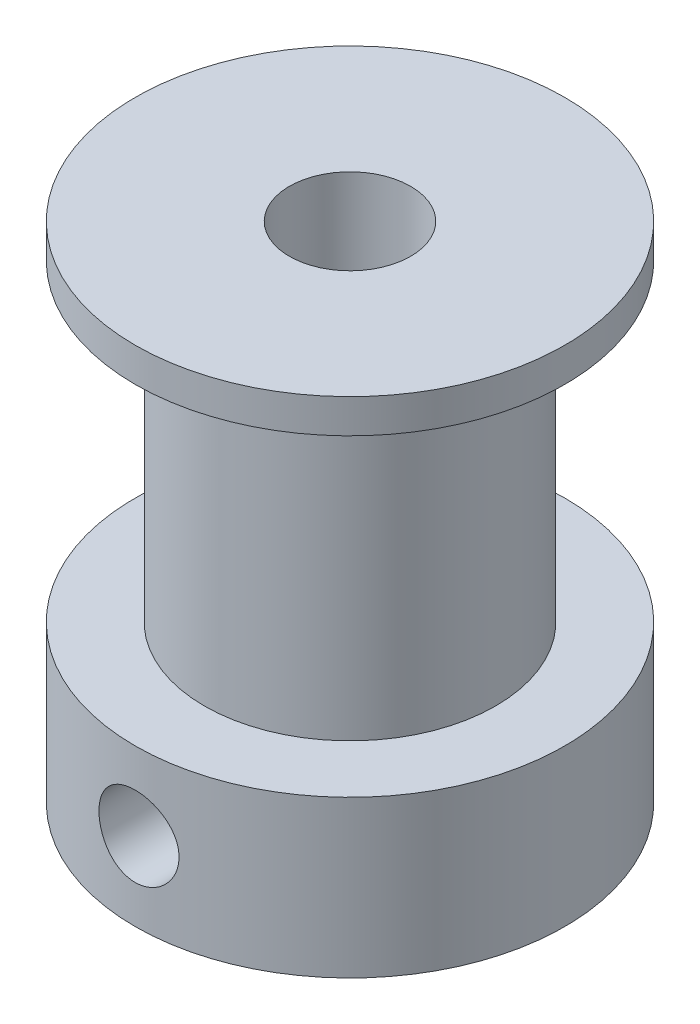
ISO-10303-21;
HEADER;
FILE_DESCRIPTION(('STEP AP214'),'2;1');
FILE_NAME('part.step','',(''),(''),'','','');
FILE_SCHEMA(('AUTOMOTIVE_DESIGN { 1 0 10303 214 1 1 1 1 }'));
ENDSEC;
DATA;
#1=APPLICATION_CONTEXT('core data for automotive mechanical design processes');
#2=APPLICATION_PROTOCOL_DEFINITION('international standard','automotive_design',2000,#1);
#3=PRODUCT_CONTEXT('',#1,'mechanical');
#4=PRODUCT('Part','Part','',(#3));
#5=PRODUCT_RELATED_PRODUCT_CATEGORY('part','',(#4));
#6=PRODUCT_DEFINITION_FORMATION('','',#4);
#7=PRODUCT_DEFINITION_CONTEXT('part definition',#1,'design');
#8=PRODUCT_DEFINITION('design','',#6,#7);
#9=PRODUCT_DEFINITION_SHAPE('','',#8);
#10=(LENGTH_UNIT() NAMED_UNIT(*) SI_UNIT(.MILLI.,.METRE.));
#11=(NAMED_UNIT(*) PLANE_ANGLE_UNIT() SI_UNIT($,.RADIAN.));
#12=(NAMED_UNIT(*) SI_UNIT($,.STERADIAN.) SOLID_ANGLE_UNIT());
#13=UNCERTAINTY_MEASURE_WITH_UNIT(LENGTH_MEASURE(1.E-05),#10,'distance_accuracy_value','');
#14=(GEOMETRIC_REPRESENTATION_CONTEXT(3) GLOBAL_UNCERTAINTY_ASSIGNED_CONTEXT((#13)) GLOBAL_UNIT_ASSIGNED_CONTEXT((#10,
#11,#12)) REPRESENTATION_CONTEXT('',''));
#15=CARTESIAN_POINT('',(0.,0.,0.));
#16=DIRECTION('',(0.,0.,1.));
#17=DIRECTION('',(1.,0.,0.));
#18=AXIS2_PLACEMENT_3D('',#15,#16,#17);
#19=CARTESIAN_POINT('',(0.,0.,0.));
#20=DIRECTION('',(0.,-1.,0.));
#21=DIRECTION('',(0.,0.,-1.));
#22=AXIS2_PLACEMENT_3D('',#19,#20,#21);
#23=CYLINDRICAL_SURFACE('',#22,2.5);
#24=CARTESIAN_POINT('',(-1.8781639970993,3.225,-1.65));
#25=CARTESIAN_POINT('',(-1.87817356740867,3.30579427655975,-1.64999443072167));
#26=CARTESIAN_POINT('',(-1.88347418282792,3.38662636905579,-1.64401449371116));
#27=CARTESIAN_POINT('',(-1.90365752241832,3.54541795060532,-1.62058860250623));
#28=CARTESIAN_POINT('',(-1.9185574504896,3.62337201591593,-1.60312206083479));
#29=CARTESIAN_POINT('',(-1.95530612756548,3.77363333158224,-1.55807727538571));
#30=CARTESIAN_POINT('',(-1.97708883218856,3.84598643150526,-1.53059477126484));
#31=CARTESIAN_POINT('',(-2.02503214275444,3.98494524738078,-1.46657517741326));
#32=CARTESIAN_POINT('',(-2.05119370638084,4.05154970122849,-1.43003610611277));
#33=CARTESIAN_POINT('',(-2.10971828562918,4.18821736687682,-1.342483593019));
#34=CARTESIAN_POINT('',(-2.14241946389367,4.25726727651007,-1.29011420470095));
#35=CARTESIAN_POINT('',(-2.20758221587981,4.38647714614391,-1.17514144468482));
#36=CARTESIAN_POINT('',(-2.24004353252863,4.44662860029669,-1.11252840012499));
#37=CARTESIAN_POINT('',(-2.3064419767716,4.56473271619889,-0.968234915676898));
#38=CARTESIAN_POINT('',(-2.33994640603816,4.62119090363769,-0.885111648041922));
#39=CARTESIAN_POINT('',(-2.39949293751456,4.71884115428655,-0.707908997031479));
#40=CARTESIAN_POINT('',(-2.42554320107045,4.76004992824281,-0.613841755901944));
#41=CARTESIAN_POINT('',(-2.46464353514927,4.82107361226671,-0.428365536633289));
#42=CARTESIAN_POINT('',(-2.47881191391302,4.84274914948944,-0.337811072451694));
#43=CARTESIAN_POINT('',(-2.49700266516609,4.87049014711654,-0.153380704926468));
#44=CARTESIAN_POINT('',(-2.50103745363967,4.87657471024375,-0.0595090091735767));
#45=CARTESIAN_POINT('',(-2.49868729659539,4.87300862462096,0.113712663637895));
#46=CARTESIAN_POINT('',(-2.49376656842582,4.86556933208685,0.193140500290932));
#47=CARTESIAN_POINT('',(-2.47671798966374,4.83953692457822,0.3493383081911));
#48=CARTESIAN_POINT('',(-2.46458960851095,4.8209429885018,0.426108083336214));
#49=CARTESIAN_POINT('',(-2.4341916732427,4.77358528412734,0.574862419576147));
#50=CARTESIAN_POINT('',(-2.41593946394568,4.74485022722838,0.646859815580448));
#51=CARTESIAN_POINT('',(-2.37464804586783,4.67831789592823,0.785017034503281));
#52=CARTESIAN_POINT('',(-2.35160793342518,4.64051891060689,0.851175752075152));
#53=CARTESIAN_POINT('',(-2.29902245001357,4.55144819163509,0.985047000791304));
#54=CARTESIAN_POINT('',(-2.26902056419845,4.49906230137878,1.05183695764555));
#55=CARTESIAN_POINT('',(-2.2070921891754,4.38519022775839,1.17625968695307));
#56=CARTESIAN_POINT('',(-2.17516278943165,4.32369006733423,1.2338781079658));
#57=CARTESIAN_POINT('',(-2.10711048312635,4.18250690257425,1.34724934289721));
#58=CARTESIAN_POINT('',(-2.07108428413496,4.10148069757491,1.40139996434746));
#59=CARTESIAN_POINT('',(-2.0043795765937,3.92947022283534,1.49525229324492));
#60=CARTESIAN_POINT('',(-1.973691925336,3.8385034211415,1.53497883258691));
#61=CARTESIAN_POINT('',(-1.93021206234819,3.67504901179961,1.58906609884216));
#62=CARTESIAN_POINT('',(-1.91481376393407,3.60458306194073,1.60742065844977));
#63=CARTESIAN_POINT('',(-1.89156962487726,3.46068483824098,1.63471528383588));
#64=CARTESIAN_POINT('',(-1.88371114115,3.38725774603094,1.64367111218457));
#65=CARTESIAN_POINT('',(-1.8767563549997,3.23913898103529,1.65161100823904));
#66=CARTESIAN_POINT('',(-1.87769482426888,3.16444345582033,1.65055550398266));
#67=CARTESIAN_POINT('',(-1.88825914723377,3.01646670785288,1.6384550878589));
#68=CARTESIAN_POINT('',(-1.89789215655036,2.94318670082213,1.62740194790476));
#69=CARTESIAN_POINT('',(-1.92377320788271,2.80315606994752,1.59670654181037));
#70=CARTESIAN_POINT('',(-1.9397182942886,2.7362601566981,1.57745493961547));
#71=CARTESIAN_POINT('',(-1.97637475195715,2.60658821030647,1.53127715983157));
#72=CARTESIAN_POINT('',(-1.99708770330354,2.54381355184297,1.50434843731629));
#73=CARTESIAN_POINT('',(-2.04592024038531,2.41084653371123,1.43744371796295));
#74=CARTESIAN_POINT('',(-2.0746933834994,2.34166627761783,1.3959374151933));
#75=CARTESIAN_POINT('',(-2.13386307226145,2.2104540035836,1.30370192953132));
#76=CARTESIAN_POINT('',(-2.16426156090022,2.14843083426984,1.2529615255776));
#77=CARTESIAN_POINT('',(-2.23066104299162,2.02002279309447,1.13132559349666));
#78=CARTESIAN_POINT('',(-2.26650752858329,1.95542825569478,1.0584336843705));
#79=CARTESIAN_POINT('',(-2.33354741548986,1.83929294484175,0.901029136145232));
#80=CARTESIAN_POINT('',(-2.36474520160667,1.78773983785047,0.816527594120797));
#81=CARTESIAN_POINT('',(-2.41383928477658,1.70846296196824,0.655022436944607));
#82=CARTESIAN_POINT('',(-2.43314294605933,1.67805320616478,0.579766982761487));
#83=CARTESIAN_POINT('',(-2.46500344203446,1.62840770004291,0.424305717798088));
#84=CARTESIAN_POINT('',(-2.47756592552064,1.60916259316718,0.344104114697706));
#85=CARTESIAN_POINT('',(-2.49483359194805,1.58280779187866,0.180532057501464));
#86=CARTESIAN_POINT('',(-2.49950622522129,1.57574836698325,0.0971499203467964));
#87=CARTESIAN_POINT('',(-2.50041880991432,1.57436521725825,-0.0697703046886496));
#88=CARTESIAN_POINT('',(-2.49665914509096,1.58004091284884,-0.153308385299506));
#89=CARTESIAN_POINT('',(-2.48162224491363,1.60295948175331,-0.31224884206867));
#90=CARTESIAN_POINT('',(-2.47086791156197,1.61939826797345,-0.387820405838241));
#91=CARTESIAN_POINT('',(-2.44325497490618,1.66222616352496,-0.534890956581204));
#92=CARTESIAN_POINT('',(-2.4263954123254,1.68861683656131,-0.606389301510793));
#93=CARTESIAN_POINT('',(-2.38659098522815,1.75225696718865,-0.748299731070002));
#94=CARTESIAN_POINT('',(-2.36333062488106,1.79008395318078,-0.818362050887261));
#95=CARTESIAN_POINT('',(-2.31298664760703,1.87460758414193,-0.951399734920284));
#96=CARTESIAN_POINT('',(-2.2859005630314,1.92130996063965,-1.0143704774724));
#97=CARTESIAN_POINT('',(-2.22528132748969,2.03052907515258,-1.14186276834818));
#98=CARTESIAN_POINT('',(-2.19140310364951,2.09437720174746,-1.20508031729177));
#99=CARTESIAN_POINT('',(-2.12387294022856,2.23156834044152,-1.32046767601713));
#100=CARTESIAN_POINT('',(-2.09022116132146,2.30491747200145,-1.37263030790415));
#101=CARTESIAN_POINT('',(-2.02963185186414,2.45297320198263,-1.46053735742483));
#102=CARTESIAN_POINT('',(-2.00236030827309,2.52689495776457,-1.49736813204505));
#103=CARTESIAN_POINT('',(-1.95397052678841,2.68110913288329,-1.55999123252305));
#104=CARTESIAN_POINT('',(-1.93283919103843,2.76138751989308,-1.58580711054237));
#105=CARTESIAN_POINT('',(-1.90415675714691,2.9056913968137,-1.62004735146957));
#106=CARTESIAN_POINT('',(-1.89451740482451,2.96864690760695,-1.63122690692698));
#107=CARTESIAN_POINT('',(-1.88151889606352,3.09606080182247,-1.64620346660995));
#108=CARTESIAN_POINT('',(-1.8781563590673,3.16051835732424,-1.65000444482246));
#109=CARTESIAN_POINT('',(-1.8781639970993,3.225,-1.65));
#110=B_SPLINE_CURVE_WITH_KNOTS('',3,(#24,#25,#26,#27,#28,#29,#30,#31,#32,#33,#34,#35,#36,#37,
#38,#39,#40,#41,#42,#43,#44,#45,#46,#47,#48,#49,#50,#51,#52,#53,#54,#55,#56,#57,#58,#59,#60,#61,
#62,#63,#64,#65,#66,#67,#68,#69,#70,#71,#72,#73,#74,#75,#76,#77,#78,#79,#80,#81,#82,#83,#84,#85,
#86,#87,#88,#89,#90,#91,#92,#93,#94,#95,#96,#97,#98,#99,#100,#101,#102,#103,#104,#105,#106,#107,
#108,#109),.UNSPECIFIED.,.T.,.F.,(4,2,2,2,2,2,2,2,2,2,2,2,2,2,2,2,2,2,2,2,2,2,2,2,2,2,2,2,2,2,2,
2,2,2,2,2,2,2,2,2,2,2,4),(0.,0.242089089232209,0.484613262365225,0.724877542229117,
0.965194438206264,1.24204242334406,1.5191533550871,1.83517136959404,2.1508420497088,
2.43163690958526,2.71208756281942,2.95071293244789,3.18935586962917,3.42732851395789,
3.66534611375403,3.93440451568683,4.20387988176699,4.51414003592554,4.82386349786489,
5.04625677123859,5.26827647088753,5.49117411610791,5.71425537389902,5.92772322794784,
6.14126192794924,6.39732261532281,6.65369656488882,6.9635657507811,7.27314078239636,
7.52238413686408,7.77141830954321,8.02147738775785,8.27152508592672,8.50474641601317,
8.73800440662634,8.98590102363144,9.23395827408608,9.52089661145361,9.80802068929721,
10.067982581361,10.327385800336,10.5207004402689,10.713910935025),.UNSPECIFIED.);
#111=CARTESIAN_POINT('',(-1.8781639970993,3.225,-1.65));
#112=VERTEX_POINT('',#111);
#113=EDGE_CURVE('E121',#112,#112,#110,.T.);
#114=ORIENTED_EDGE('',*,*,#113,.F.);
#115=EDGE_LOOP('',(#114));
#116=FACE_BOUND('',#115,.T.);
#117=CARTESIAN_POINT('',(-1.64999999999999,3.225,1.8781639970993));
#118=CARTESIAN_POINT('',(-1.64999443072166,3.30579427655975,1.87817356740867));
#119=CARTESIAN_POINT('',(-1.64401449371115,3.38662636905579,1.88347418282793));
#120=CARTESIAN_POINT('',(-1.62058860250622,3.54541795060532,1.90365752241832));
#121=CARTESIAN_POINT('',(-1.60312206083479,3.62337201591593,1.91855745048961));
#122=CARTESIAN_POINT('',(-1.5580772753857,3.77363333158224,1.95530612756548));
#123=CARTESIAN_POINT('',(-1.53059477126484,3.84598643150526,1.97708883218856));
#124=CARTESIAN_POINT('',(-1.46657517741325,3.98494524738078,2.02503214275445));
#125=CARTESIAN_POINT('',(-1.43003610611276,4.05154970122849,2.05119370638085));
#126=CARTESIAN_POINT('',(-1.34248359301899,4.18821736687682,2.10971828562919));
#127=CARTESIAN_POINT('',(-1.29011420470094,4.25726727651007,2.14241946389367));
#128=CARTESIAN_POINT('',(-1.17514144468481,4.38647714614391,2.20758221587982));
#129=CARTESIAN_POINT('',(-1.11252840012498,4.44662860029669,2.24004353252863));
#130=CARTESIAN_POINT('',(-0.968234915676889,4.56473271619889,2.3064419767716));
#131=CARTESIAN_POINT('',(-0.885111648041914,4.62119090363769,2.33994640603817));
#132=CARTESIAN_POINT('',(-0.70790899703147,4.71884115428655,2.39949293751456));
#133=CARTESIAN_POINT('',(-0.613841755901935,4.76004992824282,2.42554320107045));
#134=CARTESIAN_POINT('',(-0.42836553663328,4.82107361226671,2.46464353514927));
#135=CARTESIAN_POINT('',(-0.337811072451685,4.84274914948944,2.47881191391302));
#136=CARTESIAN_POINT('',(-0.153380704926458,4.87049014711654,2.49700266516609));
#137=CARTESIAN_POINT('',(-0.0595090091735671,4.87657471024375,2.50103745363967));
#138=CARTESIAN_POINT('',(0.113712663637905,4.87300862462096,2.49868729659539));
#139=CARTESIAN_POINT('',(0.193140500290941,4.86556933208685,2.49376656842582));
#140=CARTESIAN_POINT('',(0.349338308191109,4.83953692457822,2.47671798966374));
#141=CARTESIAN_POINT('',(0.426108083336223,4.8209429885018,2.46458960851095));
#142=CARTESIAN_POINT('',(0.574862419576157,4.77358528412734,2.4341916732427));
#143=CARTESIAN_POINT('',(0.646859815580457,4.74485022722838,2.41593946394568));
#144=CARTESIAN_POINT('',(0.78501703450329,4.67831789592823,2.37464804586783));
#145=CARTESIAN_POINT('',(0.851175752075161,4.64051891060689,2.35160793342517));
#146=CARTESIAN_POINT('',(0.985047000791314,4.55144819163509,2.29902245001356));
#147=CARTESIAN_POINT('',(1.05183695764556,4.49906230137878,2.26902056419845));
#148=CARTESIAN_POINT('',(1.17625968695308,4.38519022775838,2.20709218917539));
#149=CARTESIAN_POINT('',(1.23387810796581,4.32369006733423,2.17516278943164));
#150=CARTESIAN_POINT('',(1.34724934289721,4.18250690257425,2.10711048312634));
#151=CARTESIAN_POINT('',(1.40139996434747,4.10148069757491,2.07108428413495));
#152=CARTESIAN_POINT('',(1.49525229324493,3.92947022283534,2.00437957659369));
#153=CARTESIAN_POINT('',(1.53497883258691,3.8385034211415,1.973691925336));
#154=CARTESIAN_POINT('',(1.58906609884217,3.67504901179961,1.93021206234819));
#155=CARTESIAN_POINT('',(1.60742065844978,3.60458306194073,1.91481376393406));
#156=CARTESIAN_POINT('',(1.63471528383588,3.46068483824098,1.89156962487725));
#157=CARTESIAN_POINT('',(1.64367111218458,3.38725774603093,1.88371114115));
#158=CARTESIAN_POINT('',(1.65161100823905,3.23913898103529,1.8767563549997));
#159=CARTESIAN_POINT('',(1.65055550398267,3.16444345582033,1.87769482426888));
#160=CARTESIAN_POINT('',(1.63845508785891,3.01646670785288,1.88825914723377));
#161=CARTESIAN_POINT('',(1.62740194790476,2.94318670082213,1.89789215655036));
#162=CARTESIAN_POINT('',(1.59670654181038,2.80315606994752,1.92377320788271));
#163=CARTESIAN_POINT('',(1.57745493961548,2.7362601566981,1.9397182942886));
#164=CARTESIAN_POINT('',(1.53127715983158,2.60658821030647,1.97637475195714));
#165=CARTESIAN_POINT('',(1.50434843731629,2.54381355184297,1.99708770330354));
#166=CARTESIAN_POINT('',(1.43744371796296,2.41084653371123,2.0459202403853));
#167=CARTESIAN_POINT('',(1.39593741519331,2.34166627761783,2.07469338349939));
#168=CARTESIAN_POINT('',(1.30370192953132,2.2104540035836,2.13386307226145));
#169=CARTESIAN_POINT('',(1.25296152557761,2.14843083426984,2.16426156090021));
#170=CARTESIAN_POINT('',(1.13132559349666,2.02002279309446,2.23066104299161));
#171=CARTESIAN_POINT('',(1.0584336843705,1.95542825569478,2.26650752858329));
#172=CARTESIAN_POINT('',(0.901029136145238,1.83929294484174,2.33354741548986));
#173=CARTESIAN_POINT('',(0.816527594120802,1.78773983785047,2.36474520160667));
#174=CARTESIAN_POINT('',(0.655022436944612,1.70846296196824,2.41383928477658));
#175=CARTESIAN_POINT('',(0.579766982761492,1.67805320616478,2.43314294605933));
#176=CARTESIAN_POINT('',(0.424305717798094,1.62840770004291,2.46500344203446));
#177=CARTESIAN_POINT('',(0.344104114697712,1.60916259316718,2.47756592552063));
#178=CARTESIAN_POINT('',(0.18053205750147,1.58280779187866,2.49483359194805));
#179=CARTESIAN_POINT('',(0.0971499203468021,1.57574836698325,2.49950622522129));
#180=CARTESIAN_POINT('',(-0.0697703046886438,1.57436521725825,2.50041880991432));
#181=CARTESIAN_POINT('',(-0.1533083852995,1.58004091284884,2.49665914509096));
#182=CARTESIAN_POINT('',(-0.312248842068665,1.60295948175331,2.48162224491364));
#183=CARTESIAN_POINT('',(-0.387820405838235,1.61939826797345,2.47086791156197));
#184=CARTESIAN_POINT('',(-0.534890956581198,1.66222616352496,2.44325497490618));
#185=CARTESIAN_POINT('',(-0.606389301510787,1.68861683656131,2.4263954123254));
#186=CARTESIAN_POINT('',(-0.748299731069997,1.75225696718865,2.38659098522815));
#187=CARTESIAN_POINT('',(-0.818362050887255,1.79008395318078,2.36333062488106));
#188=CARTESIAN_POINT('',(-0.951399734920279,1.87460758414193,2.31298664760704));
#189=CARTESIAN_POINT('',(-1.01437047747239,1.92130996063965,2.2859005630314));
#190=CARTESIAN_POINT('',(-1.14186276834818,2.03052907515258,2.2252813274897));
#191=CARTESIAN_POINT('',(-1.20508031729177,2.09437720174746,2.19140310364951));
#192=CARTESIAN_POINT('',(-1.32046767601712,2.23156834044153,2.12387294022856));
#193=CARTESIAN_POINT('',(-1.37263030790415,2.30491747200145,2.09022116132146));
#194=CARTESIAN_POINT('',(-1.46053735742482,2.45297320198263,2.02963185186414));
#195=CARTESIAN_POINT('',(-1.49736813204505,2.52689495776457,2.00236030827309));
#196=CARTESIAN_POINT('',(-1.55999123252305,2.68110913288329,1.95397052678842));
#197=CARTESIAN_POINT('',(-1.58580711054236,2.76138751989309,1.93283919103844));
#198=CARTESIAN_POINT('',(-1.62004735146956,2.9056913968137,1.90415675714692));
#199=CARTESIAN_POINT('',(-1.63122690692697,2.96864690760695,1.89451740482452));
#200=CARTESIAN_POINT('',(-1.64620346660994,3.09606080182247,1.88151889606352));
#201=CARTESIAN_POINT('',(-1.65000444482246,3.16051835732424,1.87815635906731));
#202=CARTESIAN_POINT('',(-1.64999999999999,3.225,1.8781639970993));
#203=B_SPLINE_CURVE_WITH_KNOTS('',3,(#117,#118,#119,#120,#121,#122,#123,#124,#125,#126,#127,
#128,#129,#130,#131,#132,#133,#134,#135,#136,#137,#138,#139,#140,#141,#142,#143,#144,#145,#146,
#147,#148,#149,#150,#151,#152,#153,#154,#155,#156,#157,#158,#159,#160,#161,#162,#163,#164,#165,
#166,#167,#168,#169,#170,#171,#172,#173,#174,#175,#176,#177,#178,#179,#180,#181,#182,#183,#184,
#185,#186,#187,#188,#189,#190,#191,#192,#193,#194,#195,#196,#197,#198,#199,#200,#201,#202),
.UNSPECIFIED.,.T.,.F.,(4,2,2,2,2,2,2,2,2,2,2,2,2,2,2,2,2,2,2,2,2,2,2,2,2,2,2,2,2,2,2,2,2,2,2,2,
2,2,2,2,2,2,4),(0.,0.242089089232209,0.484613262365225,0.724877542229118,0.965194438206264,
1.24204242334406,1.5191533550871,1.83517136959404,2.1508420497088,2.43163690958526,
2.71208756281942,2.95071293244789,3.18935586962917,3.42732851395789,3.66534611375403,
3.93440451568684,4.20387988176699,4.51414003592554,4.82386349786489,5.04625677123859,
5.26827647088753,5.49117411610792,5.71425537389902,5.92772322794784,6.14126192794924,
6.39732261532282,6.65369656488882,6.9635657507811,7.27314078239636,7.52238413686409,
7.77141830954321,8.02147738775785,8.27152508592672,8.50474641601317,8.73800440662634,
8.98590102363144,9.23395827408609,9.52089661145361,9.80802068929721,10.067982581361,
10.327385800336,10.5207004402689,10.713910935025),.UNSPECIFIED.);
#204=CARTESIAN_POINT('',(-1.64999999999999,3.225,1.8781639970993));
#205=VERTEX_POINT('',#204);
#206=EDGE_CURVE('E65',#205,#205,#203,.T.);
#207=ORIENTED_EDGE('',*,*,#206,.F.);
#208=EDGE_LOOP('',(#207));
#209=FACE_BOUND('',#208,.T.);
#210=CARTESIAN_POINT('',(0.,0.,0.));
#211=DIRECTION('',(0.,-1.,0.));
#212=DIRECTION('',(0.,0.,-1.));
#213=AXIS2_PLACEMENT_3D('',#210,#211,#212);
#214=CIRCLE('',#213,2.5);
#215=CARTESIAN_POINT('',(0.,0.,-2.5));
#216=VERTEX_POINT('',#215);
#217=EDGE_CURVE('E62',#216,#216,#214,.T.);
#218=ORIENTED_EDGE('',*,*,#217,.T.);
#219=EDGE_LOOP('',(#218));
#220=FACE_BOUND('',#219,.T.);
#221=CARTESIAN_POINT('',(0.,20.75,0.));
#222=DIRECTION('',(0.,-1.,0.));
#223=DIRECTION('',(0.,0.,-1.));
#224=AXIS2_PLACEMENT_3D('',#221,#222,#223);
#225=CIRCLE('',#224,2.5);
#226=CARTESIAN_POINT('',(0.,20.75,-2.5));
#227=VERTEX_POINT('',#226);
#228=EDGE_CURVE('E10',#227,#227,#225,.T.);
#229=ORIENTED_EDGE('',*,*,#228,.F.);
#230=EDGE_LOOP('',(#229));
#231=FACE_BOUND('',#230,.T.);
#232=ADVANCED_FACE('F33',(#116,#209,#220,#231),#23,.F.);
#233=CARTESIAN_POINT('',(2.5,20.75,0.));
#234=DIRECTION('',(0.,1.,0.));
#235=DIRECTION('',(0.,0.,1.));
#236=AXIS2_PLACEMENT_3D('',#233,#234,#235);
#237=PLANE('',#236);
#238=ORIENTED_EDGE('',*,*,#228,.T.);
#239=EDGE_LOOP('',(#238));
#240=FACE_BOUND('',#239,.T.);
#241=CARTESIAN_POINT('',(0.,20.75,0.));
#242=DIRECTION('',(0.,-1.,0.));
#243=DIRECTION('',(0.,0.,-1.));
#244=AXIS2_PLACEMENT_3D('',#241,#242,#243);
#245=CIRCLE('',#244,8.85);
#246=CARTESIAN_POINT('',(0.,20.75,-8.85));
#247=VERTEX_POINT('',#246);
#248=EDGE_CURVE('E40',#247,#247,#245,.T.);
#249=ORIENTED_EDGE('',*,*,#248,.F.);
#250=EDGE_LOOP('',(#249));
#251=FACE_BOUND('',#250,.T.);
#252=ADVANCED_FACE('F109',(#240,#251),#237,.T.);
#253=CARTESIAN_POINT('',(0.,0.,0.));
#254=DIRECTION('',(0.,-1.,0.));
#255=DIRECTION('',(0.,0.,-1.));
#256=AXIS2_PLACEMENT_3D('',#253,#254,#255);
#257=CYLINDRICAL_SURFACE('',#256,8.85);
#258=ORIENTED_EDGE('',*,*,#248,.T.);
#259=EDGE_LOOP('',(#258));
#260=FACE_BOUND('',#259,.T.);
#261=CARTESIAN_POINT('',(0.,19.35,0.));
#262=DIRECTION('',(0.,-1.,0.));
#263=DIRECTION('',(0.,0.,-1.));
#264=AXIS2_PLACEMENT_3D('',#261,#262,#263);
#265=CIRCLE('',#264,8.85);
#266=CARTESIAN_POINT('',(0.,19.35,-8.85));
#267=VERTEX_POINT('',#266);
#268=EDGE_CURVE('E44',#267,#267,#265,.T.);
#269=ORIENTED_EDGE('',*,*,#268,.F.);
#270=EDGE_LOOP('',(#269));
#271=FACE_BOUND('',#270,.T.);
#272=ADVANCED_FACE('F106',(#260,#271),#257,.T.);
#273=CARTESIAN_POINT('',(8.85,19.35,0.));
#274=DIRECTION('',(0.,-1.,0.));
#275=DIRECTION('',(0.,0.,-1.));
#276=AXIS2_PLACEMENT_3D('',#273,#274,#275);
#277=PLANE('',#276);
#278=ORIENTED_EDGE('',*,*,#268,.T.);
#279=EDGE_LOOP('',(#278));
#280=FACE_BOUND('',#279,.T.);
#281=CARTESIAN_POINT('',(0.,19.35,0.));
#282=DIRECTION('',(0.,-1.,0.));
#283=DIRECTION('',(0.,0.,-1.));
#284=AXIS2_PLACEMENT_3D('',#281,#282,#283);
#285=CIRCLE('',#284,6.);
#286=CARTESIAN_POINT('',(0.,19.35,-6.));
#287=VERTEX_POINT('',#286);
#288=EDGE_CURVE('E48',#287,#287,#285,.T.);
#289=ORIENTED_EDGE('',*,*,#288,.F.);
#290=EDGE_LOOP('',(#289));
#291=FACE_BOUND('',#290,.T.);
#292=ADVANCED_FACE('F102',(#280,#291),#277,.T.);
#293=CARTESIAN_POINT('',(0.,0.,0.));
#294=DIRECTION('',(0.,-1.,0.));
#295=DIRECTION('',(0.,0.,-1.));
#296=AXIS2_PLACEMENT_3D('',#293,#294,#295);
#297=CYLINDRICAL_SURFACE('',#296,6.);
#298=ORIENTED_EDGE('',*,*,#288,.T.);
#299=EDGE_LOOP('',(#298));
#300=FACE_BOUND('',#299,.T.);
#301=CARTESIAN_POINT('',(0.,6.45,0.));
#302=DIRECTION('',(0.,-1.,0.));
#303=DIRECTION('',(0.,0.,-1.));
#304=AXIS2_PLACEMENT_3D('',#301,#302,#303);
#305=CIRCLE('',#304,6.);
#306=CARTESIAN_POINT('',(0.,6.45,-6.));
#307=VERTEX_POINT('',#306);
#308=EDGE_CURVE('E53',#307,#307,#305,.T.);
#309=ORIENTED_EDGE('',*,*,#308,.F.);
#310=EDGE_LOOP('',(#309));
#311=FACE_BOUND('',#310,.T.);
#312=ADVANCED_FACE('F98',(#300,#311),#297,.T.);
#313=CARTESIAN_POINT('',(6.,6.45,0.));
#314=DIRECTION('',(0.,1.,0.));
#315=DIRECTION('',(0.,0.,1.));
#316=AXIS2_PLACEMENT_3D('',#313,#314,#315);
#317=PLANE('',#316);
#318=ORIENTED_EDGE('',*,*,#308,.T.);
#319=EDGE_LOOP('',(#318));
#320=FACE_BOUND('',#319,.T.);
#321=CARTESIAN_POINT('',(0.,6.45,0.));
#322=DIRECTION('',(0.,-1.,0.));
#323=DIRECTION('',(0.,0.,-1.));
#324=AXIS2_PLACEMENT_3D('',#321,#322,#323);
#325=CIRCLE('',#324,8.85);
#326=CARTESIAN_POINT('',(0.,6.45,-8.85));
#327=VERTEX_POINT('',#326);
#328=EDGE_CURVE('E56',#327,#327,#325,.T.);
#329=ORIENTED_EDGE('',*,*,#328,.F.);
#330=EDGE_LOOP('',(#329));
#331=FACE_BOUND('',#330,.T.);
#332=ADVANCED_FACE('F94',(#320,#331),#317,.T.);
#333=CARTESIAN_POINT('',(0.,0.,0.));
#334=DIRECTION('',(0.,-1.,0.));
#335=DIRECTION('',(0.,0.,-1.));
#336=AXIS2_PLACEMENT_3D('',#333,#334,#335);
#337=CYLINDRICAL_SURFACE('',#336,8.85);
#338=CARTESIAN_POINT('',(-8.69482604771366,3.225,-1.65000000000002));
#339=CARTESIAN_POINT('',(-8.69482781961836,3.13318712551225,-1.64999646851443));
#340=CARTESIAN_POINT('',(-8.69629608283365,3.04132832099242,-1.64231072640125));
#341=CARTESIAN_POINT('',(-8.70200328524835,2.86020022456551,-1.61179115936412));
#342=CARTESIAN_POINT('',(-8.70624458573472,2.77093320732685,-1.58894442435651));
#343=CARTESIAN_POINT('',(-8.71700118617981,2.59763569117552,-1.52882830359618));
#344=CARTESIAN_POINT('',(-8.72351437901603,2.51360042476467,-1.49157227862262));
#345=CARTESIAN_POINT('',(-8.73807839736241,2.35297850515584,-1.40373041963031));
#346=CARTESIAN_POINT('',(-8.74612910005477,2.27639125773975,-1.35314565020235));
#347=CARTESIAN_POINT('',(-8.76297169239113,2.13189099300826,-1.23941864709532));
#348=CARTESIAN_POINT('',(-8.77177077636014,2.06408294233414,-1.17614408945541));
#349=CARTESIAN_POINT('',(-8.78905513475797,1.93998028874922,-1.03911962454139));
#350=CARTESIAN_POINT('',(-8.79754038866609,1.88368643764148,-0.965369033782185));
#351=CARTESIAN_POINT('',(-8.81331804879978,1.78380836630473,-0.808797051465479));
#352=CARTESIAN_POINT('',(-8.82060099132401,1.74032304599185,-0.725911535870358));
#353=CARTESIAN_POINT('',(-8.83307293463117,1.66793352616749,-0.553852864123929));
#354=CARTESIAN_POINT('',(-8.83826210561995,1.63902814138333,-0.464680219755369));
#355=CARTESIAN_POINT('',(-8.84591101367105,1.5969434064353,-0.283666132693808));
#356=CARTESIAN_POINT('',(-8.84840143451171,1.58358713603932,-0.191867140916775));
#357=CARTESIAN_POINT('',(-8.85047798041754,1.57242856772837,-0.00729976500797046));
#358=CARTESIAN_POINT('',(-8.85006435012314,1.57462495964029,0.0854685368106706));
#359=CARTESIAN_POINT('',(-8.84640339377218,1.59437356052834,0.268128074283779));
#360=CARTESIAN_POINT('',(-8.84319122195267,1.61173527536113,0.358040711914525));
#361=CARTESIAN_POINT('',(-8.8343335205522,1.66102047520029,0.533653730977177));
#362=CARTESIAN_POINT('',(-8.82868790303014,1.69294448646879,0.619353960054212));
#363=CARTESIAN_POINT('',(-8.81553884111321,1.77062999625587,0.784662740791316));
#364=CARTESIAN_POINT('',(-8.80802519842167,1.8164677695893,0.86423460340672));
#365=CARTESIAN_POINT('',(-8.7919712231604,1.92062345273677,1.01462834113705));
#366=CARTESIAN_POINT('',(-8.78343078735099,1.97894261796236,1.08544933493525));
#367=CARTESIAN_POINT('',(-8.76611656375867,2.10745571061062,1.2174594850533));
#368=CARTESIAN_POINT('',(-8.75734120124785,2.17781628665316,1.27848631073482));
#369=CARTESIAN_POINT('',(-8.74067002480942,2.32785944468152,1.38789759603455));
#370=CARTESIAN_POINT('',(-8.73277422346778,2.40754216002788,1.43628187475914));
#371=CARTESIAN_POINT('',(-8.71875394667089,2.57418148364569,1.51908012694809));
#372=CARTESIAN_POINT('',(-8.71263243982109,2.66114997214302,1.55347072569812));
#373=CARTESIAN_POINT('',(-8.70289948493759,2.83977036581416,1.60710640444723));
#374=CARTESIAN_POINT('',(-8.69928775595223,2.93142174553835,1.62635317972085));
#375=CARTESIAN_POINT('',(-8.69503880971876,3.11534307325788,1.64891830623663));
#376=CARTESIAN_POINT('',(-8.69435806245767,3.20758344347491,1.65246978029953));
#377=CARTESIAN_POINT('',(-8.69593169929538,3.39133926360538,1.6441682082256));
#378=CARTESIAN_POINT('',(-8.69818593996467,3.48285474872324,1.63231591485338));
#379=CARTESIAN_POINT('',(-8.7053350259378,3.66179798712419,1.59374330856129));
#380=CARTESIAN_POINT('',(-8.71020818991237,3.74925298707807,1.56714501727844));
#381=CARTESIAN_POINT('',(-8.72202738597335,3.9184650278529,1.49996483343461));
#382=CARTESIAN_POINT('',(-8.72897356932747,4.00022165232756,1.45938192038577));
#383=CARTESIAN_POINT('',(-8.74425537945855,4.15674374779096,1.36484721407609));
#384=CARTESIAN_POINT('',(-8.75260596783922,4.23141871699891,1.31074804031415));
#385=CARTESIAN_POINT('',(-8.76971351211558,4.37071509755618,1.1909154151686));
#386=CARTESIAN_POINT('',(-8.7784705040675,4.43533561464992,1.12518093003598));
#387=CARTESIAN_POINT('',(-8.79554392699136,4.55355864078241,0.982902890935281));
#388=CARTESIAN_POINT('',(-8.80385301579686,4.60700443476976,0.906228098094822));
#389=CARTESIAN_POINT('',(-8.81897119598209,4.70025530072996,0.744852397817091));
#390=CARTESIAN_POINT('',(-8.82578034464982,4.74006089370236,0.660151797090437));
#391=CARTESIAN_POINT('',(-8.83709984520675,4.80466632645883,0.485563559444987));
#392=CARTESIAN_POINT('',(-8.8416220090402,4.82954339698783,0.3957053007157));
#393=CARTESIAN_POINT('',(-8.84790837921588,4.86383221423075,0.212993840869886));
#394=CARTESIAN_POINT('',(-8.84967287233642,4.87324556906716,0.120140952198863));
#395=CARTESIAN_POINT('',(-8.85023947633553,4.87628427454869,-0.0644206011572592));
#396=CARTESIAN_POINT('',(-8.8490860170238,4.87014641151001,-0.156125314974752));
#397=CARTESIAN_POINT('',(-8.84403855830965,4.84277516860376,-0.337172528151278));
#398=CARTESIAN_POINT('',(-8.84014458454545,4.82154192995728,-0.426515049601113));
#399=CARTESIAN_POINT('',(-8.83005350199115,4.76468198415919,-0.600178469048796));
#400=CARTESIAN_POINT('',(-8.82386038468533,4.72908021257061,-0.684507777717209));
#401=CARTESIAN_POINT('',(-8.80984173169271,4.64452207324249,-0.846031236682501));
#402=CARTESIAN_POINT('',(-8.80201608830005,4.59556482431015,-0.923224915721279));
#403=CARTESIAN_POINT('',(-8.78545622022546,4.48486908910628,-1.06946650303304));
#404=CARTESIAN_POINT('',(-8.77671069725579,4.42295940583059,-1.1383835614211));
#405=CARTESIAN_POINT('',(-8.75936841281081,4.28847167859243,-1.2649327828544));
#406=CARTESIAN_POINT('',(-8.75077168679307,4.21589112989528,-1.32256228898502));
#407=CARTESIAN_POINT('',(-8.73461461878074,4.06132933365503,-1.42539442795117));
#408=CARTESIAN_POINT('',(-8.72706445726125,3.97926829636792,-1.47047878049901));
#409=CARTESIAN_POINT('',(-8.71397773582027,3.80862286667966,-1.54614967862008));
#410=CARTESIAN_POINT('',(-8.70843927038216,3.72004474355189,-1.57674995216177));
#411=CARTESIAN_POINT('',(-8.7011618261326,3.56350038828557,-1.61634203559836));
#412=CARTESIAN_POINT('',(-8.69879997010431,3.49645245910847,-1.62894221526526));
#413=CARTESIAN_POINT('',(-8.69563144400441,3.36127810312156,-1.64577239651984));
#414=CARTESIAN_POINT('',(-8.69482473244794,3.29315170512975,-1.65000262138364));
#415=CARTESIAN_POINT('',(-8.69482604771366,3.225,-1.65000000000002));
#416=B_SPLINE_CURVE_WITH_KNOTS('',3,(#338,#339,#340,#341,#342,#343,#344,#345,#346,#347,#348,
#349,#350,#351,#352,#353,#354,#355,#356,#357,#358,#359,#360,#361,#362,#363,#364,#365,#366,#367,
#368,#369,#370,#371,#372,#373,#374,#375,#376,#377,#378,#379,#380,#381,#382,#383,#384,#385,#386,
#387,#388,#389,#390,#391,#392,#393,#394,#395,#396,#397,#398,#399,#400,#401,#402,#403,#404,#405,
#406,#407,#408,#409,#410,#411,#412,#413,#414,#415),.UNSPECIFIED.,.T.,.F.,(4,2,2,2,2,2,2,2,2,2,2,
2,2,2,2,2,2,2,2,2,2,2,2,2,2,2,2,2,2,2,2,2,2,2,2,2,2,2,4),(0.,0.275189231168615,
0.550613096225518,0.825782188895181,1.10092930997352,1.37911056598153,1.65730997963981,
1.93760432688636,2.21787588399072,2.49492629867896,2.77195337461801,3.04554991158284,
3.31915633674794,3.59429061490545,3.86945257981618,4.14878682949561,4.42812507576014,
4.70792802533318,4.9876996479214,5.2633015385756,5.53888996138523,5.81223124033559,
6.08559246981063,6.3620754969727,6.63858310084262,6.91874099333438,7.19888818375445,
7.47757328709685,7.75622940722651,8.03066822563216,8.30510447662649,8.57906649708678,
8.85304659790226,9.1309069995889,9.40883272690785,9.68929631029677,9.96949353617282,
10.1737689796611,10.3780389738435),.UNSPECIFIED.);
#417=CARTESIAN_POINT('',(-8.69482604771366,3.225,-1.65000000000002));
#418=VERTEX_POINT('',#417);
#419=EDGE_CURVE('E131',#418,#418,#416,.T.);
#420=ORIENTED_EDGE('',*,*,#419,.F.);
#421=EDGE_LOOP('',(#420));
#422=FACE_BOUND('',#421,.T.);
#423=CARTESIAN_POINT('',(-1.64999999999999,3.225,8.69482604771367));
#424=CARTESIAN_POINT('',(-1.6499964685144,3.13318712551225,8.69482781961837));
#425=CARTESIAN_POINT('',(-1.64231072640122,3.04132832099242,8.69629608283366));
#426=CARTESIAN_POINT('',(-1.61179115936409,2.86020022456551,8.70200328524835));
#427=CARTESIAN_POINT('',(-1.58894442435648,2.77093320732685,8.70624458573473));
#428=CARTESIAN_POINT('',(-1.52882830359615,2.59763569117552,8.71700118617981));
#429=CARTESIAN_POINT('',(-1.49157227862258,2.51360042476467,8.72351437901603));
#430=CARTESIAN_POINT('',(-1.40373041963028,2.35297850515584,8.73807839736241));
#431=CARTESIAN_POINT('',(-1.35314565020232,2.27639125773975,8.74612910005477));
#432=CARTESIAN_POINT('',(-1.23941864709529,2.13189099300826,8.76297169239114));
#433=CARTESIAN_POINT('',(-1.17614408945538,2.06408294233414,8.77177077636014));
#434=CARTESIAN_POINT('',(-1.03911962454136,1.93998028874922,8.78905513475797));
#435=CARTESIAN_POINT('',(-0.965369033782154,1.88368643764148,8.7975403886661));
#436=CARTESIAN_POINT('',(-0.808797051465449,1.78380836630473,8.81331804879978));
#437=CARTESIAN_POINT('',(-0.725911535870327,1.74032304599185,8.82060099132401));
#438=CARTESIAN_POINT('',(-0.553852864123899,1.66793352616749,8.83307293463118));
#439=CARTESIAN_POINT('',(-0.464680219755338,1.63902814138333,8.83826210561995));
#440=CARTESIAN_POINT('',(-0.283666132693777,1.5969434064353,8.84591101367105));
#441=CARTESIAN_POINT('',(-0.191867140916745,1.58358713603932,8.84840143451171));
#442=CARTESIAN_POINT('',(-0.00729976500793966,1.57242856772837,8.85047798041754));
#443=CARTESIAN_POINT('',(0.0854685368107014,1.57462495964029,8.85006435012314));
#444=CARTESIAN_POINT('',(0.26812807428381,1.59437356052834,8.84640339377218));
#445=CARTESIAN_POINT('',(0.358040711914556,1.61173527536113,8.84319122195267));
#446=CARTESIAN_POINT('',(0.533653730977208,1.66102047520029,8.8343335205522));
#447=CARTESIAN_POINT('',(0.619353960054243,1.69294448646879,8.82868790303014));
#448=CARTESIAN_POINT('',(0.784662740791348,1.77062999625587,8.81553884111321));
#449=CARTESIAN_POINT('',(0.864234603406751,1.8164677695893,8.80802519842167));
#450=CARTESIAN_POINT('',(1.01462834113708,1.92062345273677,8.7919712231604));
#451=CARTESIAN_POINT('',(1.08544933493528,1.97894261796236,8.78343078735099));
#452=CARTESIAN_POINT('',(1.21745948505333,2.10745571061062,8.76611656375866));
#453=CARTESIAN_POINT('',(1.27848631073486,2.17781628665316,8.75734120124784));
#454=CARTESIAN_POINT('',(1.38789759603458,2.32785944468152,8.74067002480941));
#455=CARTESIAN_POINT('',(1.43628187475917,2.40754216002788,8.73277422346778));
#456=CARTESIAN_POINT('',(1.51908012694812,2.57418148364569,8.71875394667089));
#457=CARTESIAN_POINT('',(1.55347072569815,2.66114997214302,8.71263243982108));
#458=CARTESIAN_POINT('',(1.60710640444726,2.83977036581416,8.70289948493758));
#459=CARTESIAN_POINT('',(1.62635317972088,2.93142174553835,8.69928775595222));
#460=CARTESIAN_POINT('',(1.64891830623666,3.11534307325788,8.69503880971875));
#461=CARTESIAN_POINT('',(1.65246978029956,3.20758344347491,8.69435806245766));
#462=CARTESIAN_POINT('',(1.64416820822564,3.39133926360538,8.69593169929537));
#463=CARTESIAN_POINT('',(1.63231591485342,3.48285474872324,8.69818593996466));
#464=CARTESIAN_POINT('',(1.59374330856132,3.66179798712419,8.7053350259378));
#465=CARTESIAN_POINT('',(1.56714501727847,3.74925298707808,8.71020818991237));
#466=CARTESIAN_POINT('',(1.49996483343464,3.9184650278529,8.72202738597334));
#467=CARTESIAN_POINT('',(1.4593819203858,4.00022165232756,8.72897356932746));
#468=CARTESIAN_POINT('',(1.36484721407612,4.15674374779096,8.74425537945855));
#469=CARTESIAN_POINT('',(1.31074804031418,4.23141871699891,8.75260596783921));
#470=CARTESIAN_POINT('',(1.19091541516863,4.37071509755618,8.76971351211557));
#471=CARTESIAN_POINT('',(1.12518093003601,4.43533561464992,8.77847050406749));
#472=CARTESIAN_POINT('',(0.982902890935312,4.55355864078241,8.79554392699136));
#473=CARTESIAN_POINT('',(0.906228098094853,4.60700443476976,8.80385301579685));
#474=CARTESIAN_POINT('',(0.744852397817122,4.70025530072996,8.81897119598209));
#475=CARTESIAN_POINT('',(0.660151797090468,4.74006089370236,8.82578034464982));
#476=CARTESIAN_POINT('',(0.485563559445018,4.80466632645883,8.83709984520675));
#477=CARTESIAN_POINT('',(0.395705300715731,4.82954339698783,8.84162200904019));
#478=CARTESIAN_POINT('',(0.212993840869918,4.86383221423075,8.84790837921588));
#479=CARTESIAN_POINT('',(0.120140952198894,4.87324556906716,8.84967287233641));
#480=CARTESIAN_POINT('',(-0.0644206011572275,4.87628427454869,8.85023947633553));
#481=CARTESIAN_POINT('',(-0.15612531497472,4.87014641151001,8.8490860170238));
#482=CARTESIAN_POINT('',(-0.337172528151246,4.84277516860376,8.84403855830965));
#483=CARTESIAN_POINT('',(-0.426515049601082,4.82154192995728,8.84014458454545));
#484=CARTESIAN_POINT('',(-0.600178469048764,4.76468198415918,8.83005350199115));
#485=CARTESIAN_POINT('',(-0.684507777717177,4.72908021257061,8.82386038468533));
#486=CARTESIAN_POINT('',(-0.84603123668247,4.64452207324249,8.80984173169271));
#487=CARTESIAN_POINT('',(-0.923224915721247,4.59556482431015,8.80201608830006));
#488=CARTESIAN_POINT('',(-1.06946650303301,4.48486908910628,8.78545622022546));
#489=CARTESIAN_POINT('',(-1.13838356142107,4.42295940583059,8.77671069725579));
#490=CARTESIAN_POINT('',(-1.26493278285437,4.28847167859243,8.75936841281082));
#491=CARTESIAN_POINT('',(-1.32256228898499,4.21589112989528,8.75077168679308));
#492=CARTESIAN_POINT('',(-1.42539442795114,4.06132933365503,8.73461461878074));
#493=CARTESIAN_POINT('',(-1.47047878049898,3.97926829636792,8.72706445726126));
#494=CARTESIAN_POINT('',(-1.54614967862005,3.80862286667966,8.71397773582027));
#495=CARTESIAN_POINT('',(-1.57674995216174,3.72004474355189,8.70843927038216));
#496=CARTESIAN_POINT('',(-1.61634203559833,3.56350038828557,8.7011618261326));
#497=CARTESIAN_POINT('',(-1.62894221526523,3.49645245910847,8.69879997010431));
#498=CARTESIAN_POINT('',(-1.64577239651981,3.36127810312156,8.69563144400442));
#499=CARTESIAN_POINT('',(-1.65000262138361,3.29315170512975,8.69482473244794));
#500=CARTESIAN_POINT('',(-1.64999999999999,3.225,8.69482604771367));
#501=B_SPLINE_CURVE_WITH_KNOTS('',3,(#423,#424,#425,#426,#427,#428,#429,#430,#431,#432,#433,
#434,#435,#436,#437,#438,#439,#440,#441,#442,#443,#444,#445,#446,#447,#448,#449,#450,#451,#452,
#453,#454,#455,#456,#457,#458,#459,#460,#461,#462,#463,#464,#465,#466,#467,#468,#469,#470,#471,
#472,#473,#474,#475,#476,#477,#478,#479,#480,#481,#482,#483,#484,#485,#486,#487,#488,#489,#490,
#491,#492,#493,#494,#495,#496,#497,#498,#499,#500),.UNSPECIFIED.,.T.,.F.,(4,2,2,2,2,2,2,2,2,2,2,
2,2,2,2,2,2,2,2,2,2,2,2,2,2,2,2,2,2,2,2,2,2,2,2,2,2,2,4),(0.,0.275189231168615,
0.550613096225518,0.825782188895181,1.10092930997352,1.37911056598153,1.65730997963981,
1.93760432688636,2.21787588399072,2.49492629867896,2.77195337461801,3.04554991158284,
3.31915633674794,3.59429061490545,3.86945257981618,4.14878682949561,4.42812507576014,
4.70792802533318,4.9876996479214,5.2633015385756,5.53888996138523,5.81223124033559,
6.08559246981063,6.3620754969727,6.63858310084262,6.91874099333438,7.19888818375445,
7.47757328709685,7.75622940722651,8.03066822563216,8.30510447662649,8.57906649708677,
8.85304659790226,9.1309069995889,9.40883272690785,9.68929631029677,9.96949353617282,
10.1737689796611,10.3780389738435),.UNSPECIFIED.);
#502=CARTESIAN_POINT('',(-1.64999999999999,3.225,8.69482604771367));
#503=VERTEX_POINT('',#502);
#504=EDGE_CURVE('E71',#503,#503,#501,.T.);
#505=ORIENTED_EDGE('',*,*,#504,.F.);
#506=EDGE_LOOP('',(#505));
#507=FACE_BOUND('',#506,.T.);
#508=ORIENTED_EDGE('',*,*,#328,.T.);
#509=EDGE_LOOP('',(#508));
#510=FACE_BOUND('',#509,.T.);
#511=CARTESIAN_POINT('',(0.,0.,0.));
#512=DIRECTION('',(0.,-1.,0.));
#513=DIRECTION('',(0.,0.,-1.));
#514=AXIS2_PLACEMENT_3D('',#511,#512,#513);
#515=CIRCLE('',#514,8.85);
#516=CARTESIAN_POINT('',(0.,0.,-8.85));
#517=VERTEX_POINT('',#516);
#518=EDGE_CURVE('E59',#517,#517,#515,.T.);
#519=ORIENTED_EDGE('',*,*,#518,.F.);
#520=EDGE_LOOP('',(#519));
#521=FACE_BOUND('',#520,.T.);
#522=ADVANCED_FACE('F90',(#422,#507,#510,#521),#337,.T.);
#523=CARTESIAN_POINT('',(8.85,0.,0.));
#524=DIRECTION('',(0.,-1.,0.));
#525=DIRECTION('',(0.,0.,-1.));
#526=AXIS2_PLACEMENT_3D('',#523,#524,#525);
#527=PLANE('',#526);
#528=ORIENTED_EDGE('',*,*,#518,.T.);
#529=EDGE_LOOP('',(#528));
#530=FACE_BOUND('',#529,.T.);
#531=ORIENTED_EDGE('',*,*,#217,.F.);
#532=EDGE_LOOP('',(#531));
#533=FACE_BOUND('',#532,.T.);
#534=ADVANCED_FACE('F81',(#530,#533),#527,.T.);
#535=CARTESIAN_POINT('',(0.,3.225,0.));
#536=DIRECTION('',(0.,0.,-1.));
#537=DIRECTION('',(-1.,0.,0.));
#538=AXIS2_PLACEMENT_3D('',#535,#536,#537);
#539=CYLINDRICAL_SURFACE('',#538,1.64999999999999);
#540=ORIENTED_EDGE('',*,*,#206,.T.);
#541=EDGE_LOOP('',(#540));
#542=FACE_BOUND('',#541,.T.);
#543=ORIENTED_EDGE('',*,*,#504,.T.);
#544=EDGE_LOOP('',(#543));
#545=FACE_BOUND('',#544,.T.);
#546=ADVANCED_FACE('F76',(#542,#545),#539,.F.);
#547=CARTESIAN_POINT('',(0.,3.225,0.));
#548=DIRECTION('',(1.,0.,0.));
#549=DIRECTION('',(0.,0.,-1.));
#550=AXIS2_PLACEMENT_3D('',#547,#548,#549);
#551=CYLINDRICAL_SURFACE('',#550,1.64999999999999);
#552=ORIENTED_EDGE('',*,*,#113,.T.);
#553=EDGE_LOOP('',(#552));
#554=FACE_BOUND('',#553,.T.);
#555=ORIENTED_EDGE('',*,*,#419,.T.);
#556=EDGE_LOOP('',(#555));
#557=FACE_BOUND('',#556,.T.);
#558=ADVANCED_FACE('F80',(#554,#557),#551,.F.);
#559=CLOSED_SHELL('',(#232,#252,#272,#292,#312,#332,#522,#534,#546,#558));
#560=MANIFOLD_SOLID_BREP('B2',#559);
#561=ADVANCED_BREP_SHAPE_REPRESENTATION('',(#18,#560),#14);
#562=SHAPE_DEFINITION_REPRESENTATION(#9,#561);
ENDSEC;
END-ISO-10303-21;
